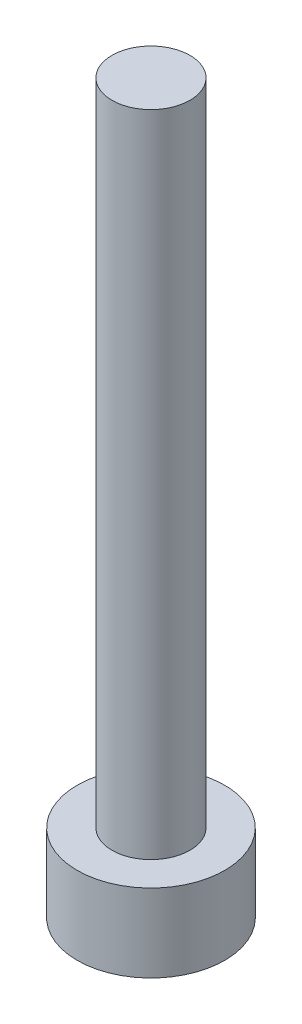
ISO-10303-21;
HEADER;
FILE_DESCRIPTION(('STEP AP214'),'2;1');
FILE_NAME('part.step','',(''),(''),'','','');
FILE_SCHEMA(('AUTOMOTIVE_DESIGN { 1 0 10303 214 1 1 1 1 }'));
ENDSEC;
DATA;
#1=APPLICATION_CONTEXT('core data for automotive mechanical design processes');
#2=APPLICATION_PROTOCOL_DEFINITION('international standard','automotive_design',2000,#1);
#3=PRODUCT_CONTEXT('',#1,'mechanical');
#4=PRODUCT('Part','Part','',(#3));
#5=PRODUCT_RELATED_PRODUCT_CATEGORY('part','',(#4));
#6=PRODUCT_DEFINITION_FORMATION('','',#4);
#7=PRODUCT_DEFINITION_CONTEXT('part definition',#1,'design');
#8=PRODUCT_DEFINITION('design','',#6,#7);
#9=PRODUCT_DEFINITION_SHAPE('','',#8);
#10=(LENGTH_UNIT() NAMED_UNIT(*) SI_UNIT(.MILLI.,.METRE.));
#11=(NAMED_UNIT(*) PLANE_ANGLE_UNIT() SI_UNIT($,.RADIAN.));
#12=(NAMED_UNIT(*) SI_UNIT($,.STERADIAN.) SOLID_ANGLE_UNIT());
#13=UNCERTAINTY_MEASURE_WITH_UNIT(LENGTH_MEASURE(1.E-05),#10,'distance_accuracy_value','');
#14=(GEOMETRIC_REPRESENTATION_CONTEXT(3) GLOBAL_UNCERTAINTY_ASSIGNED_CONTEXT((#13)) GLOBAL_UNIT_ASSIGNED_CONTEXT((#10,
#11,#12)) REPRESENTATION_CONTEXT('',''));
#15=CARTESIAN_POINT('',(0.,0.,0.));
#16=DIRECTION('',(0.,0.,1.));
#17=DIRECTION('',(1.,0.,0.));
#18=AXIS2_PLACEMENT_3D('',#15,#16,#17);
#19=CARTESIAN_POINT('',(0.,3.,0.));
#20=DIRECTION('',(0.,-1.,0.));
#21=DIRECTION('',(0.,0.,-1.));
#22=AXIS2_PLACEMENT_3D('',#19,#20,#21);
#23=CYLINDRICAL_SURFACE('',#22,2.84);
#24=CARTESIAN_POINT('',(0.,3.,0.));
#25=DIRECTION('',(0.,1.,0.));
#26=DIRECTION('',(0.,0.,1.));
#27=AXIS2_PLACEMENT_3D('',#24,#25,#26);
#28=CIRCLE('',#27,2.84);
#29=CARTESIAN_POINT('',(0.,3.,2.84));
#30=VERTEX_POINT('',#29);
#31=EDGE_CURVE('E41',#30,#30,#28,.T.);
#32=ORIENTED_EDGE('',*,*,#31,.F.);
#33=EDGE_LOOP('',(#32));
#34=FACE_BOUND('',#33,.T.);
#35=CARTESIAN_POINT('',(0.,0.,0.));
#36=DIRECTION('',(0.,1.,0.));
#37=DIRECTION('',(0.,0.,1.));
#38=AXIS2_PLACEMENT_3D('',#35,#36,#37);
#39=CIRCLE('',#38,2.84);
#40=CARTESIAN_POINT('',(0.,0.,2.84));
#41=VERTEX_POINT('',#40);
#42=EDGE_CURVE('E36',#41,#41,#39,.T.);
#43=ORIENTED_EDGE('',*,*,#42,.T.);
#44=EDGE_LOOP('',(#43));
#45=FACE_BOUND('',#44,.T.);
#46=ADVANCED_FACE('F33',(#34,#45),#23,.T.);
#47=CARTESIAN_POINT('',(0.,3.,0.));
#48=DIRECTION('',(0.,1.,0.));
#49=DIRECTION('',(0.,0.,1.));
#50=AXIS2_PLACEMENT_3D('',#47,#48,#49);
#51=PLANE('',#50);
#52=CARTESIAN_POINT('',(0.,3.,0.));
#53=DIRECTION('',(0.,1.,0.));
#54=DIRECTION('',(0.,0.,1.));
#55=AXIS2_PLACEMENT_3D('',#52,#53,#54);
#56=CIRCLE('',#55,1.5);
#57=CARTESIAN_POINT('',(0.,3.,1.5));
#58=VERTEX_POINT('',#57);
#59=EDGE_CURVE('E11',#58,#58,#56,.T.);
#60=ORIENTED_EDGE('',*,*,#59,.F.);
#61=EDGE_LOOP('',(#60));
#62=FACE_BOUND('',#61,.T.);
#63=ORIENTED_EDGE('',*,*,#31,.T.);
#64=EDGE_LOOP('',(#63));
#65=FACE_BOUND('',#64,.T.);
#66=ADVANCED_FACE('F153',(#62,#65),#51,.T.);
#67=CARTESIAN_POINT('',(0.,0.,0.));
#68=DIRECTION('',(0.,1.,0.));
#69=DIRECTION('',(0.,0.,1.));
#70=AXIS2_PLACEMENT_3D('',#67,#68,#69);
#71=PLANE('',#70);
#72=DIRECTION('',(-1.,0.,0.));
#73=VECTOR('',#72,1.);
#74=CARTESIAN_POINT('',(0.744781847254617,0.,1.29));
#75=LINE('',#74,#73);
#76=CARTESIAN_POINT('',(0.744781847254617,0.,1.29));
#77=VERTEX_POINT('',#76);
#78=CARTESIAN_POINT('',(-0.744781847254617,0.,1.29));
#79=VERTEX_POINT('',#78);
#80=EDGE_CURVE('E123',#77,#79,#75,.T.);
#81=ORIENTED_EDGE('',*,*,#80,.F.);
#82=DIRECTION('',(-0.5,0.,0.866025403784439));
#83=VECTOR('',#82,1.);
#84=CARTESIAN_POINT('',(1.48956369450923,0.,0.));
#85=LINE('',#84,#83);
#86=CARTESIAN_POINT('',(1.48956369450923,0.,0.));
#87=VERTEX_POINT('',#86);
#88=EDGE_CURVE('E49',#87,#77,#85,.T.);
#89=ORIENTED_EDGE('',*,*,#88,.F.);
#90=DIRECTION('',(0.5,0.,0.866025403784439));
#91=VECTOR('',#90,1.);
#92=CARTESIAN_POINT('',(0.744781847254617,0.,-1.29));
#93=LINE('',#92,#91);
#94=CARTESIAN_POINT('',(0.744781847254617,0.,-1.29));
#95=VERTEX_POINT('',#94);
#96=EDGE_CURVE('E132',#95,#87,#93,.T.);
#97=ORIENTED_EDGE('',*,*,#96,.F.);
#98=DIRECTION('',(1.,0.,0.));
#99=VECTOR('',#98,1.);
#100=CARTESIAN_POINT('',(-0.744781847254617,0.,-1.29));
#101=LINE('',#100,#99);
#102=CARTESIAN_POINT('',(-0.744781847254617,0.,-1.29));
#103=VERTEX_POINT('',#102);
#104=EDGE_CURVE('E130',#103,#95,#101,.T.);
#105=ORIENTED_EDGE('',*,*,#104,.F.);
#106=DIRECTION('',(0.5,0.,-0.866025403784439));
#107=VECTOR('',#106,1.);
#108=CARTESIAN_POINT('',(-1.48956369450923,0.,0.));
#109=LINE('',#108,#107);
#110=CARTESIAN_POINT('',(-1.48956369450923,0.,0.));
#111=VERTEX_POINT('',#110);
#112=EDGE_CURVE('E97',#111,#103,#109,.T.);
#113=ORIENTED_EDGE('',*,*,#112,.F.);
#114=DIRECTION('',(-0.5,0.,-0.866025403784439));
#115=VECTOR('',#114,1.);
#116=CARTESIAN_POINT('',(-0.744781847254617,0.,1.29));
#117=LINE('',#116,#115);
#118=EDGE_CURVE('E126',#79,#111,#117,.T.);
#119=ORIENTED_EDGE('',*,*,#118,.F.);
#120=EDGE_LOOP('',(#81,#89,#97,#105,#113,#119));
#121=FACE_BOUND('',#120,.T.);
#122=ORIENTED_EDGE('',*,*,#42,.F.);
#123=EDGE_LOOP('',(#122));
#124=FACE_BOUND('',#123,.T.);
#125=ADVANCED_FACE('F150',(#121,#124),#71,.F.);
#126=CARTESIAN_POINT('',(0.,28.,0.));
#127=DIRECTION('',(0.,-1.,0.));
#128=DIRECTION('',(0.,0.,-1.));
#129=AXIS2_PLACEMENT_3D('',#126,#127,#128);
#130=CYLINDRICAL_SURFACE('',#129,1.5);
#131=CARTESIAN_POINT('',(0.,28.,0.));
#132=DIRECTION('',(0.,1.,0.));
#133=DIRECTION('',(0.,0.,1.));
#134=AXIS2_PLACEMENT_3D('',#131,#132,#133);
#135=CIRCLE('',#134,1.5);
#136=CARTESIAN_POINT('',(0.,28.,1.5));
#137=VERTEX_POINT('',#136);
#138=EDGE_CURVE('E136',#137,#137,#135,.T.);
#139=ORIENTED_EDGE('',*,*,#138,.F.);
#140=EDGE_LOOP('',(#139));
#141=FACE_BOUND('',#140,.T.);
#142=ORIENTED_EDGE('',*,*,#59,.T.);
#143=EDGE_LOOP('',(#142));
#144=FACE_BOUND('',#143,.T.);
#145=ADVANCED_FACE('F152',(#141,#144),#130,.T.);
#146=CARTESIAN_POINT('',(0.,28.,0.));
#147=DIRECTION('',(0.,1.,0.));
#148=DIRECTION('',(0.,0.,1.));
#149=AXIS2_PLACEMENT_3D('',#146,#147,#148);
#150=PLANE('',#149);
#151=ORIENTED_EDGE('',*,*,#138,.T.);
#152=EDGE_LOOP('',(#151));
#153=FACE_BOUND('',#152,.T.);
#154=ADVANCED_FACE('F159',(#153),#150,.T.);
#155=CARTESIAN_POINT('',(1.48956369450923,1.3,0.));
#156=DIRECTION('',(0.866025403784439,0.,0.5));
#157=DIRECTION('',(0.5,0.,-0.866025403784439));
#158=AXIS2_PLACEMENT_3D('',#155,#156,#157);
#159=PLANE('',#158);
#160=ORIENTED_EDGE('',*,*,#88,.T.);
#161=DIRECTION('',(0.,-1.,0.));
#162=VECTOR('',#161,1.);
#163=CARTESIAN_POINT('',(0.744781847254617,1.3,1.29));
#164=LINE('',#163,#162);
#165=CARTESIAN_POINT('',(0.744781847254617,1.3,1.29));
#166=VERTEX_POINT('',#165);
#167=EDGE_CURVE('E79',#166,#77,#164,.T.);
#168=ORIENTED_EDGE('',*,*,#167,.F.);
#169=DIRECTION('',(-0.5,0.,0.866025403784439));
#170=VECTOR('',#169,1.);
#171=CARTESIAN_POINT('',(1.48956369450923,1.3,0.));
#172=LINE('',#171,#170);
#173=CARTESIAN_POINT('',(1.48956369450923,1.3,0.));
#174=VERTEX_POINT('',#173);
#175=EDGE_CURVE('E134',#174,#166,#172,.T.);
#176=ORIENTED_EDGE('',*,*,#175,.F.);
#177=DIRECTION('',(0.,-1.,0.));
#178=VECTOR('',#177,1.);
#179=CARTESIAN_POINT('',(1.48956369450923,1.3,0.));
#180=LINE('',#179,#178);
#181=EDGE_CURVE('E57',#174,#87,#180,.T.);
#182=ORIENTED_EDGE('',*,*,#181,.T.);
#183=EDGE_LOOP('',(#160,#168,#176,#182));
#184=FACE_BOUND('',#183,.T.);
#185=ADVANCED_FACE('F188',(#184),#159,.F.);
#186=CARTESIAN_POINT('',(0.744781847254617,1.3,-1.29));
#187=DIRECTION('',(0.866025403784439,0.,-0.5));
#188=DIRECTION('',(-0.5,0.,-0.866025403784439));
#189=AXIS2_PLACEMENT_3D('',#186,#187,#188);
#190=PLANE('',#189);
#191=ORIENTED_EDGE('',*,*,#96,.T.);
#192=ORIENTED_EDGE('',*,*,#181,.F.);
#193=DIRECTION('',(0.5,0.,0.866025403784439));
#194=VECTOR('',#193,1.);
#195=CARTESIAN_POINT('',(0.744781847254617,1.3,-1.29));
#196=LINE('',#195,#194);
#197=CARTESIAN_POINT('',(0.744781847254617,1.3,-1.29));
#198=VERTEX_POINT('',#197);
#199=EDGE_CURVE('E109',#198,#174,#196,.T.);
#200=ORIENTED_EDGE('',*,*,#199,.F.);
#201=DIRECTION('',(0.,-1.,0.));
#202=VECTOR('',#201,1.);
#203=CARTESIAN_POINT('',(0.744781847254617,1.3,-1.29));
#204=LINE('',#203,#202);
#205=EDGE_CURVE('E101',#198,#95,#204,.T.);
#206=ORIENTED_EDGE('',*,*,#205,.T.);
#207=EDGE_LOOP('',(#191,#192,#200,#206));
#208=FACE_BOUND('',#207,.T.);
#209=ADVANCED_FACE('F202',(#208),#190,.F.);
#210=CARTESIAN_POINT('',(-0.744781847254617,1.3,-1.29));
#211=DIRECTION('',(0.,0.,-1.));
#212=DIRECTION('',(-1.,0.,0.));
#213=AXIS2_PLACEMENT_3D('',#210,#211,#212);
#214=PLANE('',#213);
#215=ORIENTED_EDGE('',*,*,#104,.T.);
#216=ORIENTED_EDGE('',*,*,#205,.F.);
#217=DIRECTION('',(1.,0.,0.));
#218=VECTOR('',#217,1.);
#219=CARTESIAN_POINT('',(-0.744781847254617,1.3,-1.29));
#220=LINE('',#219,#218);
#221=CARTESIAN_POINT('',(-0.744781847254617,1.3,-1.29));
#222=VERTEX_POINT('',#221);
#223=EDGE_CURVE('E105',#222,#198,#220,.T.);
#224=ORIENTED_EDGE('',*,*,#223,.F.);
#225=DIRECTION('',(0.,-1.,0.));
#226=VECTOR('',#225,1.);
#227=CARTESIAN_POINT('',(-0.744781847254617,1.3,-1.29));
#228=LINE('',#227,#226);
#229=EDGE_CURVE('E90',#222,#103,#228,.T.);
#230=ORIENTED_EDGE('',*,*,#229,.T.);
#231=EDGE_LOOP('',(#215,#216,#224,#230));
#232=FACE_BOUND('',#231,.T.);
#233=ADVANCED_FACE('F106',(#232),#214,.F.);
#234=CARTESIAN_POINT('',(-1.48956369450923,1.3,0.));
#235=DIRECTION('',(-0.866025403784439,0.,-0.5));
#236=DIRECTION('',(-0.5,0.,0.866025403784439));
#237=AXIS2_PLACEMENT_3D('',#234,#235,#236);
#238=PLANE('',#237);
#239=ORIENTED_EDGE('',*,*,#112,.T.);
#240=ORIENTED_EDGE('',*,*,#229,.F.);
#241=DIRECTION('',(0.5,0.,-0.866025403784439));
#242=VECTOR('',#241,1.);
#243=CARTESIAN_POINT('',(-1.48956369450923,1.3,0.));
#244=LINE('',#243,#242);
#245=CARTESIAN_POINT('',(-1.48956369450923,1.3,0.));
#246=VERTEX_POINT('',#245);
#247=EDGE_CURVE('E94',#246,#222,#244,.T.);
#248=ORIENTED_EDGE('',*,*,#247,.F.);
#249=DIRECTION('',(0.,-1.,0.));
#250=VECTOR('',#249,1.);
#251=CARTESIAN_POINT('',(-1.48956369450923,1.3,0.));
#252=LINE('',#251,#250);
#253=EDGE_CURVE('E102',#246,#111,#252,.T.);
#254=ORIENTED_EDGE('',*,*,#253,.T.);
#255=EDGE_LOOP('',(#239,#240,#248,#254));
#256=FACE_BOUND('',#255,.T.);
#257=ADVANCED_FACE('F92',(#256),#238,.F.);
#258=CARTESIAN_POINT('',(-0.744781847254617,1.3,1.29));
#259=DIRECTION('',(-0.866025403784439,0.,0.5));
#260=DIRECTION('',(0.5,0.,0.866025403784439));
#261=AXIS2_PLACEMENT_3D('',#258,#259,#260);
#262=PLANE('',#261);
#263=ORIENTED_EDGE('',*,*,#118,.T.);
#264=ORIENTED_EDGE('',*,*,#253,.F.);
#265=DIRECTION('',(-0.5,0.,-0.866025403784439));
#266=VECTOR('',#265,1.);
#267=CARTESIAN_POINT('',(-0.744781847254617,1.3,1.29));
#268=LINE('',#267,#266);
#269=CARTESIAN_POINT('',(-0.744781847254617,1.3,1.29));
#270=VERTEX_POINT('',#269);
#271=EDGE_CURVE('E115',#270,#246,#268,.T.);
#272=ORIENTED_EDGE('',*,*,#271,.F.);
#273=DIRECTION('',(0.,-1.,0.));
#274=VECTOR('',#273,1.);
#275=CARTESIAN_POINT('',(-0.744781847254617,1.3,1.29));
#276=LINE('',#275,#274);
#277=EDGE_CURVE('E139',#270,#79,#276,.T.);
#278=ORIENTED_EDGE('',*,*,#277,.T.);
#279=EDGE_LOOP('',(#263,#264,#272,#278));
#280=FACE_BOUND('',#279,.T.);
#281=ADVANCED_FACE('F227',(#280),#262,.F.);
#282=CARTESIAN_POINT('',(0.744781847254617,1.3,1.29));
#283=DIRECTION('',(0.,0.,1.));
#284=DIRECTION('',(1.,0.,0.));
#285=AXIS2_PLACEMENT_3D('',#282,#283,#284);
#286=PLANE('',#285);
#287=ORIENTED_EDGE('',*,*,#80,.T.);
#288=ORIENTED_EDGE('',*,*,#277,.F.);
#289=DIRECTION('',(-1.,0.,0.));
#290=VECTOR('',#289,1.);
#291=CARTESIAN_POINT('',(0.744781847254617,1.3,1.29));
#292=LINE('',#291,#290);
#293=EDGE_CURVE('E117',#166,#270,#292,.T.);
#294=ORIENTED_EDGE('',*,*,#293,.F.);
#295=ORIENTED_EDGE('',*,*,#167,.T.);
#296=EDGE_LOOP('',(#287,#288,#294,#295));
#297=FACE_BOUND('',#296,.T.);
#298=ADVANCED_FACE('F236',(#297),#286,.F.);
#299=CARTESIAN_POINT('',(0.,1.3,0.));
#300=DIRECTION('',(0.,-1.,0.));
#301=DIRECTION('',(0.,0.,-1.));
#302=AXIS2_PLACEMENT_3D('',#299,#300,#301);
#303=PLANE('',#302);
#304=ORIENTED_EDGE('',*,*,#175,.T.);
#305=ORIENTED_EDGE('',*,*,#293,.T.);
#306=ORIENTED_EDGE('',*,*,#271,.T.);
#307=ORIENTED_EDGE('',*,*,#247,.T.);
#308=ORIENTED_EDGE('',*,*,#223,.T.);
#309=ORIENTED_EDGE('',*,*,#199,.T.);
#310=EDGE_LOOP('',(#304,#305,#306,#307,#308,#309));
#311=FACE_BOUND('',#310,.T.);
#312=ADVANCED_FACE('F112',(#311),#303,.T.);
#313=CLOSED_SHELL('',(#46,#66,#125,#145,#154,#185,#209,#233,#257,#281,#298,#312));
#314=MANIFOLD_SOLID_BREP('B2',#313);
#315=ADVANCED_BREP_SHAPE_REPRESENTATION('',(#18,#314),#14);
#316=SHAPE_DEFINITION_REPRESENTATION(#9,#315);
ENDSEC;
END-ISO-10303-21;
